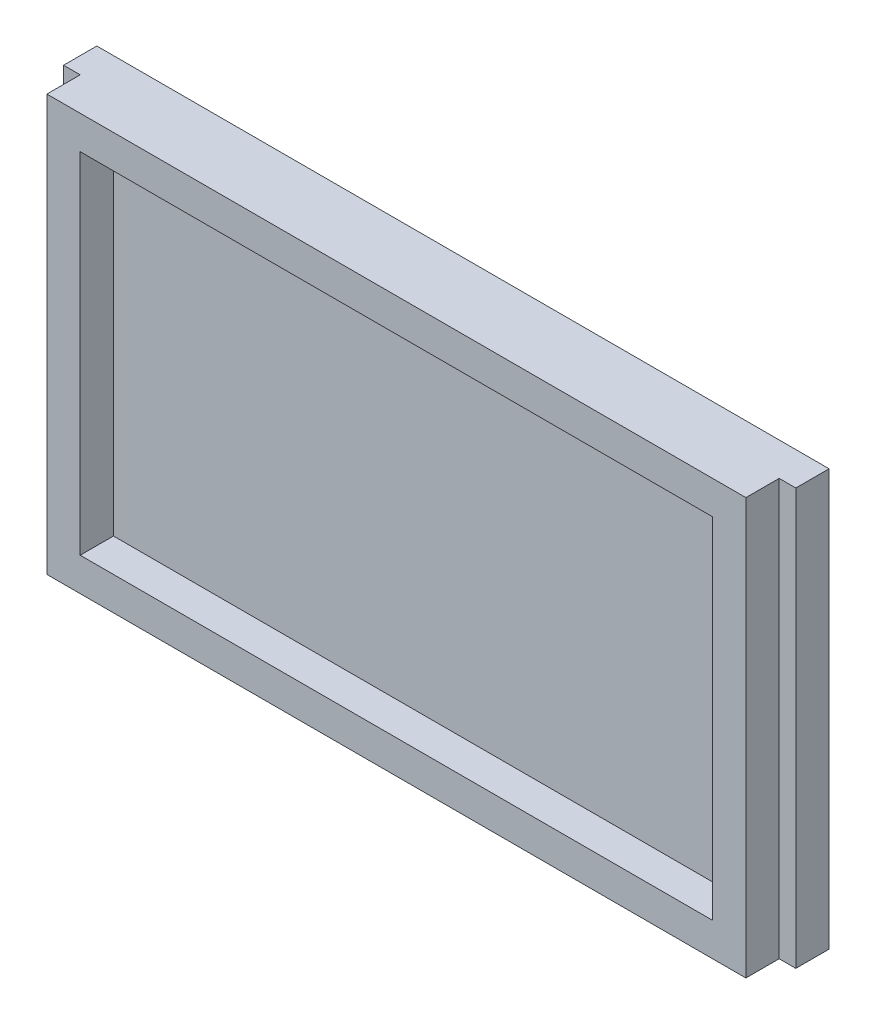
ISO-10303-21;
HEADER;
FILE_DESCRIPTION(('STEP AP214'),'2;1');
FILE_NAME('part.step','',(''),(''),'','','');
FILE_SCHEMA(('AUTOMOTIVE_DESIGN { 1 0 10303 214 1 1 1 1 }'));
ENDSEC;
DATA;
#1=APPLICATION_CONTEXT('core data for automotive mechanical design processes');
#2=APPLICATION_PROTOCOL_DEFINITION('international standard','automotive_design',2000,#1);
#3=PRODUCT_CONTEXT('',#1,'mechanical');
#4=PRODUCT('Part','Part','',(#3));
#5=PRODUCT_RELATED_PRODUCT_CATEGORY('part','',(#4));
#6=PRODUCT_DEFINITION_FORMATION('','',#4);
#7=PRODUCT_DEFINITION_CONTEXT('part definition',#1,'design');
#8=PRODUCT_DEFINITION('design','',#6,#7);
#9=PRODUCT_DEFINITION_SHAPE('','',#8);
#10=(LENGTH_UNIT() NAMED_UNIT(*) SI_UNIT(.MILLI.,.METRE.));
#11=(NAMED_UNIT(*) PLANE_ANGLE_UNIT() SI_UNIT($,.RADIAN.));
#12=(NAMED_UNIT(*) SI_UNIT($,.STERADIAN.) SOLID_ANGLE_UNIT());
#13=UNCERTAINTY_MEASURE_WITH_UNIT(LENGTH_MEASURE(1.E-05),#10,'distance_accuracy_value','');
#14=(GEOMETRIC_REPRESENTATION_CONTEXT(3) GLOBAL_UNCERTAINTY_ASSIGNED_CONTEXT((#13)) GLOBAL_UNIT_ASSIGNED_CONTEXT((#10,
#11,#12)) REPRESENTATION_CONTEXT('',''));
#15=CARTESIAN_POINT('',(0.,0.,0.));
#16=DIRECTION('',(0.,0.,1.));
#17=DIRECTION('',(1.,0.,0.));
#18=AXIS2_PLACEMENT_3D('',#15,#16,#17);
#19=CARTESIAN_POINT('',(0.,0.,2.));
#20=DIRECTION('',(0.,0.,1.));
#21=DIRECTION('',(1.,0.,0.));
#22=AXIS2_PLACEMENT_3D('',#19,#20,#21);
#23=PLANE('',#22);
#24=DIRECTION('',(0.,1.,0.));
#25=VECTOR('',#24,1.);
#26=CARTESIAN_POINT('',(21.,12.5,2.));
#27=LINE('',#26,#25);
#28=CARTESIAN_POINT('',(21.,-12.5,2.));
#29=VERTEX_POINT('',#28);
#30=CARTESIAN_POINT('',(21.,12.5,2.));
#31=VERTEX_POINT('',#30);
#32=EDGE_CURVE('E65',#29,#31,#27,.T.);
#33=ORIENTED_EDGE('',*,*,#32,.F.);
#34=DIRECTION('',(1.,0.,0.));
#35=VECTOR('',#34,1.);
#36=CARTESIAN_POINT('',(-22.,-12.5,2.));
#37=LINE('',#36,#35);
#38=CARTESIAN_POINT('',(22.,-12.5,2.));
#39=VERTEX_POINT('',#38);
#40=EDGE_CURVE('E203',#29,#39,#37,.T.);
#41=ORIENTED_EDGE('',*,*,#40,.T.);
#42=DIRECTION('',(0.,1.,0.));
#43=VECTOR('',#42,1.);
#44=CARTESIAN_POINT('',(22.,12.5,2.));
#45=LINE('',#44,#43);
#46=CARTESIAN_POINT('',(22.,12.5,2.));
#47=VERTEX_POINT('',#46);
#48=EDGE_CURVE('E195',#39,#47,#45,.T.);
#49=ORIENTED_EDGE('',*,*,#48,.T.);
#50=DIRECTION('',(-1.,0.,0.));
#51=VECTOR('',#50,1.);
#52=CARTESIAN_POINT('',(-22.,12.5,2.));
#53=LINE('',#52,#51);
#54=EDGE_CURVE('E197',#47,#31,#53,.T.);
#55=ORIENTED_EDGE('',*,*,#54,.T.);
#56=EDGE_LOOP('',(#33,#41,#49,#55));
#57=FACE_BOUND('',#56,.T.);
#58=ADVANCED_FACE('F39',(#57),#23,.T.);
#59=CARTESIAN_POINT('',(22.,12.5,2.));
#60=DIRECTION('',(-1.,0.,0.));
#61=DIRECTION('',(0.,-1.,0.));
#62=AXIS2_PLACEMENT_3D('',#59,#60,#61);
#63=PLANE('',#62);
#64=DIRECTION('',(0.,1.,0.));
#65=VECTOR('',#64,1.);
#66=CARTESIAN_POINT('',(22.,12.5,0.));
#67=LINE('',#66,#65);
#68=CARTESIAN_POINT('',(22.,-12.5,0.));
#69=VERTEX_POINT('',#68);
#70=CARTESIAN_POINT('',(22.,12.5,0.));
#71=VERTEX_POINT('',#70);
#72=EDGE_CURVE('E193',#69,#71,#67,.T.);
#73=ORIENTED_EDGE('',*,*,#72,.T.);
#74=DIRECTION('',(0.,0.,-1.));
#75=VECTOR('',#74,1.);
#76=CARTESIAN_POINT('',(22.,12.5,2.));
#77=LINE('',#76,#75);
#78=EDGE_CURVE('E11',#47,#71,#77,.T.);
#79=ORIENTED_EDGE('',*,*,#78,.F.);
#80=ORIENTED_EDGE('',*,*,#48,.F.);
#81=DIRECTION('',(0.,0.,-1.));
#82=VECTOR('',#81,1.);
#83=CARTESIAN_POINT('',(22.,-12.5,2.));
#84=LINE('',#83,#82);
#85=EDGE_CURVE('E204',#39,#69,#84,.T.);
#86=ORIENTED_EDGE('',*,*,#85,.T.);
#87=EDGE_LOOP('',(#73,#79,#80,#86));
#88=FACE_BOUND('',#87,.T.);
#89=ADVANCED_FACE('F41',(#88),#63,.F.);
#90=CARTESIAN_POINT('',(-22.,12.5,2.));
#91=DIRECTION('',(0.,-1.,0.));
#92=DIRECTION('',(0.,0.,-1.));
#93=AXIS2_PLACEMENT_3D('',#90,#91,#92);
#94=PLANE('',#93);
#95=DIRECTION('',(-1.,0.,0.));
#96=VECTOR('',#95,1.);
#97=CARTESIAN_POINT('',(-22.,12.5,0.));
#98=LINE('',#97,#96);
#99=CARTESIAN_POINT('',(-22.,12.5,0.));
#100=VERTEX_POINT('',#99);
#101=EDGE_CURVE('E210',#71,#100,#98,.T.);
#102=ORIENTED_EDGE('',*,*,#101,.T.);
#103=DIRECTION('',(0.,0.,-1.));
#104=VECTOR('',#103,1.);
#105=CARTESIAN_POINT('',(-22.,12.5,2.));
#106=LINE('',#105,#104);
#107=CARTESIAN_POINT('',(-22.,12.5,2.));
#108=VERTEX_POINT('',#107);
#109=EDGE_CURVE('E50',#108,#100,#106,.T.);
#110=ORIENTED_EDGE('',*,*,#109,.F.);
#111=CARTESIAN_POINT('',(-21.,12.5,2.));
#112=VERTEX_POINT('',#111);
#113=EDGE_CURVE('E192',#112,#108,#53,.T.);
#114=ORIENTED_EDGE('',*,*,#113,.F.);
#115=DIRECTION('',(0.,0.,-1.));
#116=VECTOR('',#115,1.);
#117=CARTESIAN_POINT('',(-21.,12.5,4.));
#118=LINE('',#117,#116);
#119=CARTESIAN_POINT('',(-21.,12.5,4.));
#120=VERTEX_POINT('',#119);
#121=EDGE_CURVE('E183',#120,#112,#118,.T.);
#122=ORIENTED_EDGE('',*,*,#121,.F.);
#123=DIRECTION('',(-1.,0.,0.));
#124=VECTOR('',#123,1.);
#125=CARTESIAN_POINT('',(-21.,12.5,4.));
#126=LINE('',#125,#124);
#127=CARTESIAN_POINT('',(21.,12.5,4.));
#128=VERTEX_POINT('',#127);
#129=EDGE_CURVE('E166',#128,#120,#126,.T.);
#130=ORIENTED_EDGE('',*,*,#129,.F.);
#131=DIRECTION('',(0.,0.,-1.));
#132=VECTOR('',#131,1.);
#133=CARTESIAN_POINT('',(21.,12.5,4.));
#134=LINE('',#133,#132);
#135=EDGE_CURVE('E189',#128,#31,#134,.T.);
#136=ORIENTED_EDGE('',*,*,#135,.T.);
#137=ORIENTED_EDGE('',*,*,#54,.F.);
#138=ORIENTED_EDGE('',*,*,#78,.T.);
#139=EDGE_LOOP('',(#102,#110,#114,#122,#130,#136,#137,#138));
#140=FACE_BOUND('',#139,.T.);
#141=ADVANCED_FACE('F253',(#140),#94,.F.);
#142=CARTESIAN_POINT('',(-22.,12.5,2.));
#143=DIRECTION('',(1.,0.,0.));
#144=DIRECTION('',(0.,1.,0.));
#145=AXIS2_PLACEMENT_3D('',#142,#143,#144);
#146=PLANE('',#145);
#147=DIRECTION('',(0.,-1.,0.));
#148=VECTOR('',#147,1.);
#149=CARTESIAN_POINT('',(-22.,12.5,0.));
#150=LINE('',#149,#148);
#151=CARTESIAN_POINT('',(-22.,-12.5,0.));
#152=VERTEX_POINT('',#151);
#153=EDGE_CURVE('E207',#100,#152,#150,.T.);
#154=ORIENTED_EDGE('',*,*,#153,.T.);
#155=DIRECTION('',(0.,0.,-1.));
#156=VECTOR('',#155,1.);
#157=CARTESIAN_POINT('',(-22.,-12.5,2.));
#158=LINE('',#157,#156);
#159=CARTESIAN_POINT('',(-22.,-12.5,2.));
#160=VERTEX_POINT('',#159);
#161=EDGE_CURVE('E212',#160,#152,#158,.T.);
#162=ORIENTED_EDGE('',*,*,#161,.F.);
#163=DIRECTION('',(0.,-1.,0.));
#164=VECTOR('',#163,1.);
#165=CARTESIAN_POINT('',(-22.,12.5,2.));
#166=LINE('',#165,#164);
#167=EDGE_CURVE('E200',#108,#160,#166,.T.);
#168=ORIENTED_EDGE('',*,*,#167,.F.);
#169=ORIENTED_EDGE('',*,*,#109,.T.);
#170=EDGE_LOOP('',(#154,#162,#168,#169));
#171=FACE_BOUND('',#170,.T.);
#172=ADVANCED_FACE('F222',(#171),#146,.F.);
#173=CARTESIAN_POINT('',(-22.,-12.5,2.));
#174=DIRECTION('',(0.,1.,0.));
#175=DIRECTION('',(0.,0.,1.));
#176=AXIS2_PLACEMENT_3D('',#173,#174,#175);
#177=PLANE('',#176);
#178=DIRECTION('',(1.,0.,0.));
#179=VECTOR('',#178,1.);
#180=CARTESIAN_POINT('',(-22.,-12.5,0.));
#181=LINE('',#180,#179);
#182=EDGE_CURVE('E198',#152,#69,#181,.T.);
#183=ORIENTED_EDGE('',*,*,#182,.T.);
#184=ORIENTED_EDGE('',*,*,#85,.F.);
#185=ORIENTED_EDGE('',*,*,#40,.F.);
#186=DIRECTION('',(0.,0.,-1.));
#187=VECTOR('',#186,1.);
#188=CARTESIAN_POINT('',(21.,-12.5,4.));
#189=LINE('',#188,#187);
#190=CARTESIAN_POINT('',(21.,-12.5,4.));
#191=VERTEX_POINT('',#190);
#192=EDGE_CURVE('E178',#191,#29,#189,.T.);
#193=ORIENTED_EDGE('',*,*,#192,.F.);
#194=DIRECTION('',(1.,0.,0.));
#195=VECTOR('',#194,1.);
#196=CARTESIAN_POINT('',(-21.,-12.5,4.));
#197=LINE('',#196,#195);
#198=CARTESIAN_POINT('',(-21.,-12.5,4.));
#199=VERTEX_POINT('',#198);
#200=EDGE_CURVE('E171',#199,#191,#197,.T.);
#201=ORIENTED_EDGE('',*,*,#200,.F.);
#202=DIRECTION('',(0.,0.,-1.));
#203=VECTOR('',#202,1.);
#204=CARTESIAN_POINT('',(-21.,-12.5,4.));
#205=LINE('',#204,#203);
#206=CARTESIAN_POINT('',(-21.,-12.5,2.));
#207=VERTEX_POINT('',#206);
#208=EDGE_CURVE('E185',#199,#207,#205,.T.);
#209=ORIENTED_EDGE('',*,*,#208,.T.);
#210=EDGE_CURVE('E205',#160,#207,#37,.T.);
#211=ORIENTED_EDGE('',*,*,#210,.F.);
#212=ORIENTED_EDGE('',*,*,#161,.T.);
#213=EDGE_LOOP('',(#183,#184,#185,#193,#201,#209,#211,#212));
#214=FACE_BOUND('',#213,.T.);
#215=ADVANCED_FACE('F233',(#214),#177,.F.);
#216=DIRECTION('',(0.,-1.,0.));
#217=VECTOR('',#216,1.);
#218=CARTESIAN_POINT('',(-21.,12.5,2.));
#219=LINE('',#218,#217);
#220=EDGE_CURVE('E168',#112,#207,#219,.T.);
#221=ORIENTED_EDGE('',*,*,#220,.F.);
#222=ORIENTED_EDGE('',*,*,#113,.T.);
#223=ORIENTED_EDGE('',*,*,#167,.T.);
#224=ORIENTED_EDGE('',*,*,#210,.T.);
#225=EDGE_LOOP('',(#221,#222,#223,#224));
#226=FACE_BOUND('',#225,.T.);
#227=ADVANCED_FACE('F247',(#226),#23,.T.);
#228=CARTESIAN_POINT('',(0.,0.,0.));
#229=DIRECTION('',(0.,0.,1.));
#230=DIRECTION('',(1.,0.,0.));
#231=AXIS2_PLACEMENT_3D('',#228,#229,#230);
#232=PLANE('',#231);
#233=ORIENTED_EDGE('',*,*,#72,.F.);
#234=ORIENTED_EDGE('',*,*,#182,.F.);
#235=ORIENTED_EDGE('',*,*,#153,.F.);
#236=ORIENTED_EDGE('',*,*,#101,.F.);
#237=EDGE_LOOP('',(#233,#234,#235,#236));
#238=FACE_BOUND('',#237,.T.);
#239=ADVANCED_FACE('F229',(#238),#232,.F.);
#240=CARTESIAN_POINT('',(21.,12.5,4.));
#241=DIRECTION('',(-1.,0.,0.));
#242=DIRECTION('',(0.,0.,1.));
#243=AXIS2_PLACEMENT_3D('',#240,#241,#242);
#244=PLANE('',#243);
#245=ORIENTED_EDGE('',*,*,#32,.T.);
#246=ORIENTED_EDGE('',*,*,#135,.F.);
#247=DIRECTION('',(0.,1.,0.));
#248=VECTOR('',#247,1.);
#249=CARTESIAN_POINT('',(21.,12.5,4.));
#250=LINE('',#249,#248);
#251=EDGE_CURVE('E167',#191,#128,#250,.T.);
#252=ORIENTED_EDGE('',*,*,#251,.F.);
#253=ORIENTED_EDGE('',*,*,#192,.T.);
#254=EDGE_LOOP('',(#245,#246,#252,#253));
#255=FACE_BOUND('',#254,.T.);
#256=ADVANCED_FACE('F238',(#255),#244,.F.);
#257=CARTESIAN_POINT('',(-21.,12.5,4.));
#258=DIRECTION('',(1.,0.,0.));
#259=DIRECTION('',(0.,1.,0.));
#260=AXIS2_PLACEMENT_3D('',#257,#258,#259);
#261=PLANE('',#260);
#262=ORIENTED_EDGE('',*,*,#220,.T.);
#263=ORIENTED_EDGE('',*,*,#208,.F.);
#264=DIRECTION('',(0.,-1.,0.));
#265=VECTOR('',#264,1.);
#266=CARTESIAN_POINT('',(-21.,12.5,4.));
#267=LINE('',#266,#265);
#268=EDGE_CURVE('E175',#120,#199,#267,.T.);
#269=ORIENTED_EDGE('',*,*,#268,.F.);
#270=ORIENTED_EDGE('',*,*,#121,.T.);
#271=EDGE_LOOP('',(#262,#263,#269,#270));
#272=FACE_BOUND('',#271,.T.);
#273=ADVANCED_FACE('F246',(#272),#261,.F.);
#274=CARTESIAN_POINT('',(0.,0.,4.));
#275=DIRECTION('',(0.,0.,1.));
#276=DIRECTION('',(1.,0.,0.));
#277=AXIS2_PLACEMENT_3D('',#274,#275,#276);
#278=PLANE('',#277);
#279=DIRECTION('',(0.,1.,0.));
#280=VECTOR('',#279,1.);
#281=CARTESIAN_POINT('',(19.,10.5,4.));
#282=LINE('',#281,#280);
#283=CARTESIAN_POINT('',(19.,-10.5,4.));
#284=VERTEX_POINT('',#283);
#285=CARTESIAN_POINT('',(19.,10.5,4.));
#286=VERTEX_POINT('',#285);
#287=EDGE_CURVE('E53',#284,#286,#282,.T.);
#288=ORIENTED_EDGE('',*,*,#287,.F.);
#289=DIRECTION('',(1.,0.,0.));
#290=VECTOR('',#289,1.);
#291=CARTESIAN_POINT('',(-19.,-10.5,4.));
#292=LINE('',#291,#290);
#293=CARTESIAN_POINT('',(-19.,-10.5,4.));
#294=VERTEX_POINT('',#293);
#295=EDGE_CURVE('E146',#294,#284,#292,.T.);
#296=ORIENTED_EDGE('',*,*,#295,.F.);
#297=DIRECTION('',(0.,-1.,0.));
#298=VECTOR('',#297,1.);
#299=CARTESIAN_POINT('',(-19.,10.5,4.));
#300=LINE('',#299,#298);
#301=CARTESIAN_POINT('',(-19.,10.5,4.));
#302=VERTEX_POINT('',#301);
#303=EDGE_CURVE('E151',#302,#294,#300,.T.);
#304=ORIENTED_EDGE('',*,*,#303,.F.);
#305=DIRECTION('',(-1.,0.,0.));
#306=VECTOR('',#305,1.);
#307=CARTESIAN_POINT('',(-19.,10.5,4.));
#308=LINE('',#307,#306);
#309=EDGE_CURVE('E160',#286,#302,#308,.T.);
#310=ORIENTED_EDGE('',*,*,#309,.F.);
#311=EDGE_LOOP('',(#288,#296,#304,#310));
#312=FACE_BOUND('',#311,.T.);
#313=ORIENTED_EDGE('',*,*,#251,.T.);
#314=ORIENTED_EDGE('',*,*,#129,.T.);
#315=ORIENTED_EDGE('',*,*,#268,.T.);
#316=ORIENTED_EDGE('',*,*,#200,.T.);
#317=EDGE_LOOP('',(#313,#314,#315,#316));
#318=FACE_BOUND('',#317,.T.);
#319=ADVANCED_FACE('F244',(#312,#318),#278,.T.);
#320=CARTESIAN_POINT('',(19.,10.5,2.));
#321=DIRECTION('',(1.,0.,0.));
#322=DIRECTION('',(0.,1.,0.));
#323=AXIS2_PLACEMENT_3D('',#320,#321,#322);
#324=PLANE('',#323);
#325=ORIENTED_EDGE('',*,*,#287,.T.);
#326=DIRECTION('',(0.,0.,1.));
#327=VECTOR('',#326,1.);
#328=CARTESIAN_POINT('',(19.,10.5,2.));
#329=LINE('',#328,#327);
#330=CARTESIAN_POINT('',(19.,10.5,2.));
#331=VERTEX_POINT('',#330);
#332=EDGE_CURVE('E127',#331,#286,#329,.T.);
#333=ORIENTED_EDGE('',*,*,#332,.F.);
#334=DIRECTION('',(0.,1.,0.));
#335=VECTOR('',#334,1.);
#336=CARTESIAN_POINT('',(19.,10.5,2.));
#337=LINE('',#336,#335);
#338=CARTESIAN_POINT('',(19.,-10.5,2.));
#339=VERTEX_POINT('',#338);
#340=EDGE_CURVE('E128',#339,#331,#337,.T.);
#341=ORIENTED_EDGE('',*,*,#340,.F.);
#342=DIRECTION('',(0.,0.,1.));
#343=VECTOR('',#342,1.);
#344=CARTESIAN_POINT('',(19.,-10.5,2.));
#345=LINE('',#344,#343);
#346=EDGE_CURVE('E161',#339,#284,#345,.T.);
#347=ORIENTED_EDGE('',*,*,#346,.T.);
#348=EDGE_LOOP('',(#325,#333,#341,#347));
#349=FACE_BOUND('',#348,.T.);
#350=ADVANCED_FACE('F126',(#349),#324,.F.);
#351=CARTESIAN_POINT('',(-19.,-10.5,2.));
#352=DIRECTION('',(0.,-1.,0.));
#353=DIRECTION('',(0.,0.,-1.));
#354=AXIS2_PLACEMENT_3D('',#351,#352,#353);
#355=PLANE('',#354);
#356=ORIENTED_EDGE('',*,*,#295,.T.);
#357=ORIENTED_EDGE('',*,*,#346,.F.);
#358=DIRECTION('',(1.,0.,0.));
#359=VECTOR('',#358,1.);
#360=CARTESIAN_POINT('',(-19.,-10.5,2.));
#361=LINE('',#360,#359);
#362=CARTESIAN_POINT('',(-19.,-10.5,2.));
#363=VERTEX_POINT('',#362);
#364=EDGE_CURVE('E138',#363,#339,#361,.T.);
#365=ORIENTED_EDGE('',*,*,#364,.F.);
#366=DIRECTION('',(0.,0.,1.));
#367=VECTOR('',#366,1.);
#368=CARTESIAN_POINT('',(-19.,-10.5,2.));
#369=LINE('',#368,#367);
#370=EDGE_CURVE('E162',#363,#294,#369,.T.);
#371=ORIENTED_EDGE('',*,*,#370,.T.);
#372=EDGE_LOOP('',(#356,#357,#365,#371));
#373=FACE_BOUND('',#372,.T.);
#374=ADVANCED_FACE('F311',(#373),#355,.F.);
#375=CARTESIAN_POINT('',(-19.,10.5,2.));
#376=DIRECTION('',(-1.,0.,0.));
#377=DIRECTION('',(0.,-1.,0.));
#378=AXIS2_PLACEMENT_3D('',#375,#376,#377);
#379=PLANE('',#378);
#380=ORIENTED_EDGE('',*,*,#303,.T.);
#381=ORIENTED_EDGE('',*,*,#370,.F.);
#382=DIRECTION('',(0.,-1.,0.));
#383=VECTOR('',#382,1.);
#384=CARTESIAN_POINT('',(-19.,10.5,2.));
#385=LINE('',#384,#383);
#386=CARTESIAN_POINT('',(-19.,10.5,2.));
#387=VERTEX_POINT('',#386);
#388=EDGE_CURVE('E145',#387,#363,#385,.T.);
#389=ORIENTED_EDGE('',*,*,#388,.F.);
#390=DIRECTION('',(0.,0.,1.));
#391=VECTOR('',#390,1.);
#392=CARTESIAN_POINT('',(-19.,10.5,2.));
#393=LINE('',#392,#391);
#394=EDGE_CURVE('E133',#387,#302,#393,.T.);
#395=ORIENTED_EDGE('',*,*,#394,.T.);
#396=EDGE_LOOP('',(#380,#381,#389,#395));
#397=FACE_BOUND('',#396,.T.);
#398=ADVANCED_FACE('F325',(#397),#379,.F.);
#399=CARTESIAN_POINT('',(-19.,10.5,2.));
#400=DIRECTION('',(0.,1.,0.));
#401=DIRECTION('',(0.,0.,1.));
#402=AXIS2_PLACEMENT_3D('',#399,#400,#401);
#403=PLANE('',#402);
#404=ORIENTED_EDGE('',*,*,#309,.T.);
#405=ORIENTED_EDGE('',*,*,#394,.F.);
#406=DIRECTION('',(-1.,0.,0.));
#407=VECTOR('',#406,1.);
#408=CARTESIAN_POINT('',(-19.,10.5,2.));
#409=LINE('',#408,#407);
#410=EDGE_CURVE('E139',#331,#387,#409,.T.);
#411=ORIENTED_EDGE('',*,*,#410,.F.);
#412=ORIENTED_EDGE('',*,*,#332,.T.);
#413=EDGE_LOOP('',(#404,#405,#411,#412));
#414=FACE_BOUND('',#413,.T.);
#415=ADVANCED_FACE('F137',(#414),#403,.F.);
#416=CARTESIAN_POINT('',(0.,0.,2.));
#417=DIRECTION('',(0.,0.,1.));
#418=DIRECTION('',(1.,0.,0.));
#419=AXIS2_PLACEMENT_3D('',#416,#417,#418);
#420=PLANE('',#419);
#421=ORIENTED_EDGE('',*,*,#340,.T.);
#422=ORIENTED_EDGE('',*,*,#410,.T.);
#423=ORIENTED_EDGE('',*,*,#388,.T.);
#424=ORIENTED_EDGE('',*,*,#364,.T.);
#425=EDGE_LOOP('',(#421,#422,#423,#424));
#426=FACE_BOUND('',#425,.T.);
#427=ADVANCED_FACE('F148',(#426),#420,.T.);
#428=CLOSED_SHELL('',(#58,#89,#141,#172,#215,#227,#239,#256,#273,#319,#350,#374,#398,#415,#427));
#429=MANIFOLD_SOLID_BREP('B2',#428);
#430=ADVANCED_BREP_SHAPE_REPRESENTATION('',(#18,#429),#14);
#431=SHAPE_DEFINITION_REPRESENTATION(#9,#430);
ENDSEC;
END-ISO-10303-21;
